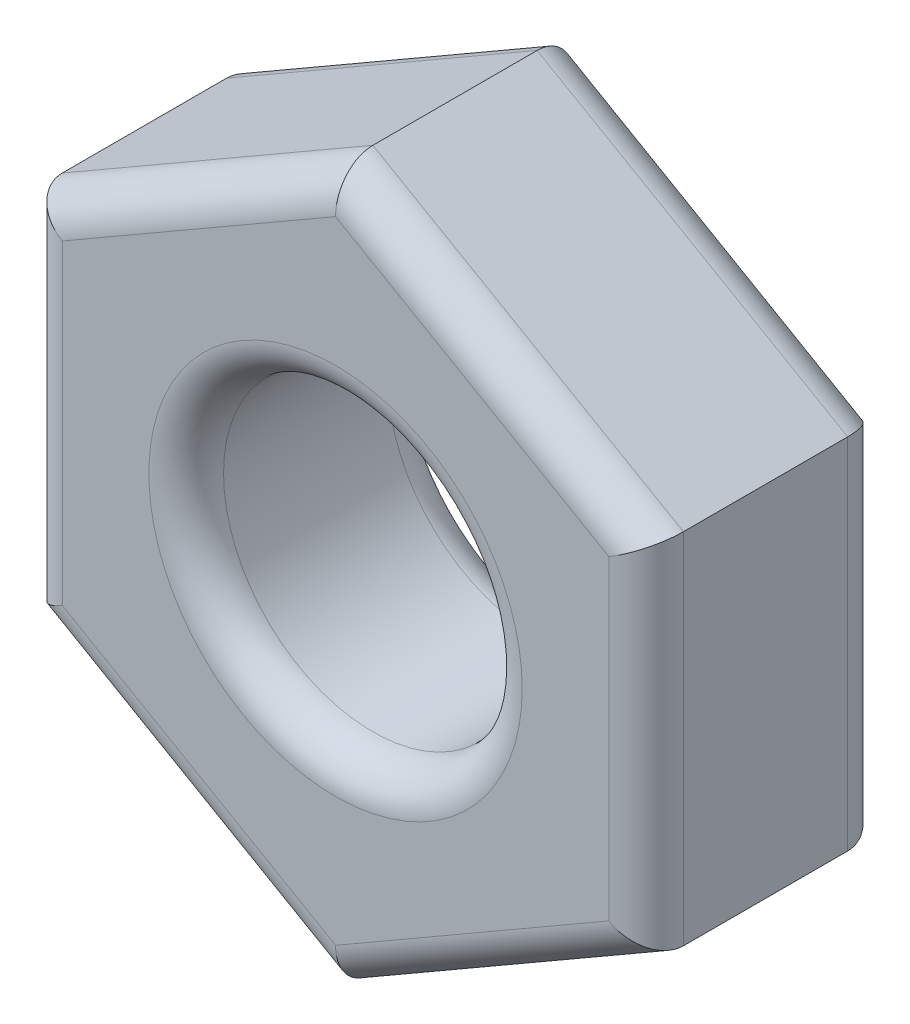
ISO-10303-21;
HEADER;
FILE_DESCRIPTION(('STEP AP214'),'2;1');
FILE_NAME('part.step','',(''),(''),'','','');
FILE_SCHEMA(('AUTOMOTIVE_DESIGN { 1 0 10303 214 1 1 1 1 }'));
ENDSEC;
DATA;
#1=APPLICATION_CONTEXT('core data for automotive mechanical design processes');
#2=APPLICATION_PROTOCOL_DEFINITION('international standard','automotive_design',2000,#1);
#3=PRODUCT_CONTEXT('',#1,'mechanical');
#4=PRODUCT('Part','Part','',(#3));
#5=PRODUCT_RELATED_PRODUCT_CATEGORY('part','',(#4));
#6=PRODUCT_DEFINITION_FORMATION('','',#4);
#7=PRODUCT_DEFINITION_CONTEXT('part definition',#1,'design');
#8=PRODUCT_DEFINITION('design','',#6,#7);
#9=PRODUCT_DEFINITION_SHAPE('','',#8);
#10=(LENGTH_UNIT() NAMED_UNIT(*) SI_UNIT(.MILLI.,.METRE.));
#11=(NAMED_UNIT(*) PLANE_ANGLE_UNIT() SI_UNIT($,.RADIAN.));
#12=(NAMED_UNIT(*) SI_UNIT($,.STERADIAN.) SOLID_ANGLE_UNIT());
#13=UNCERTAINTY_MEASURE_WITH_UNIT(LENGTH_MEASURE(1.E-05),#10,'distance_accuracy_value','');
#14=(GEOMETRIC_REPRESENTATION_CONTEXT(3) GLOBAL_UNCERTAINTY_ASSIGNED_CONTEXT((#13)) GLOBAL_UNIT_ASSIGNED_CONTEXT((#10,
#11,#12)) REPRESENTATION_CONTEXT('',''));
#15=CARTESIAN_POINT('',(0.,0.,0.));
#16=DIRECTION('',(0.,0.,1.));
#17=DIRECTION('',(1.,0.,0.));
#18=AXIS2_PLACEMENT_3D('',#15,#16,#17);
#19=CARTESIAN_POINT('',(0.,0.,0.8));
#20=DIRECTION('',(0.,0.,1.));
#21=DIRECTION('',(1.,0.,0.));
#22=AXIS2_PLACEMENT_3D('',#19,#20,#21);
#23=PLANE('',#22);
#24=CARTESIAN_POINT('',(0.,0.,0.8));
#25=DIRECTION('',(0.,0.,1.));
#26=DIRECTION('',(1.,0.,0.));
#27=AXIS2_PLACEMENT_3D('',#24,#25,#26);
#28=CIRCLE('',#27,1.25);
#29=CARTESIAN_POINT('',(1.25,0.,0.8));
#30=VERTEX_POINT('',#29);
#31=EDGE_CURVE('E153',#30,#30,#28,.F.);
#32=ORIENTED_EDGE('',*,*,#31,.T.);
#33=EDGE_LOOP('',(#32));
#34=FACE_BOUND('',#33,.T.);
#35=DIRECTION('',(0.,-1.,0.));
#36=VECTOR('',#35,1.);
#37=CARTESIAN_POINT('',(-1.83,-1.20088855991442,0.8));
#38=LINE('',#37,#36);
#39=CARTESIAN_POINT('',(-1.83,1.05655099261702,0.8));
#40=VERTEX_POINT('',#39);
#41=CARTESIAN_POINT('',(-1.83,-1.05655099261701,0.8));
#42=VERTEX_POINT('',#41);
#43=EDGE_CURVE('E151',#40,#42,#38,.T.);
#44=ORIENTED_EDGE('',*,*,#43,.T.);
#45=DIRECTION('',(0.866025403784439,-0.5,0.));
#46=VECTOR('',#45,1.);
#47=CARTESIAN_POINT('',(0.125,-2.18527076888273,0.8));
#48=LINE('',#47,#46);
#49=CARTESIAN_POINT('',(0.,-2.11310198523403,0.8));
#50=VERTEX_POINT('',#49);
#51=EDGE_CURVE('E133',#42,#50,#48,.T.);
#52=ORIENTED_EDGE('',*,*,#51,.T.);
#53=DIRECTION('',(0.866025403784439,0.5,0.));
#54=VECTOR('',#53,1.);
#55=CARTESIAN_POINT('',(1.955,-0.984382208968312,0.8));
#56=LINE('',#55,#54);
#57=CARTESIAN_POINT('',(1.83,-1.05655099261702,0.8));
#58=VERTEX_POINT('',#57);
#59=EDGE_CURVE('E141',#50,#58,#56,.T.);
#60=ORIENTED_EDGE('',*,*,#59,.T.);
#61=DIRECTION('',(0.,1.,0.));
#62=VECTOR('',#61,1.);
#63=CARTESIAN_POINT('',(1.83,1.20088855991442,0.8));
#64=LINE('',#63,#62);
#65=CARTESIAN_POINT('',(1.83,1.05655099261702,0.8));
#66=VERTEX_POINT('',#65);
#67=EDGE_CURVE('E147',#58,#66,#64,.T.);
#68=ORIENTED_EDGE('',*,*,#67,.T.);
#69=DIRECTION('',(-0.866025403784439,0.5,0.));
#70=VECTOR('',#69,1.);
#71=CARTESIAN_POINT('',(-0.125,2.18527076888273,0.8));
#72=LINE('',#71,#70);
#73=CARTESIAN_POINT('',(0.,2.11310198523403,0.8));
#74=VERTEX_POINT('',#73);
#75=EDGE_CURVE('E261',#66,#74,#72,.T.);
#76=ORIENTED_EDGE('',*,*,#75,.T.);
#77=DIRECTION('',(-0.866025403784439,-0.5,0.));
#78=VECTOR('',#77,1.);
#79=CARTESIAN_POINT('',(-1.955,0.984382208968313,0.8));
#80=LINE('',#79,#78);
#81=EDGE_CURVE('E158',#74,#40,#80,.T.);
#82=ORIENTED_EDGE('',*,*,#81,.T.);
#83=EDGE_LOOP('',(#44,#52,#60,#68,#76,#82));
#84=FACE_BOUND('',#83,.T.);
#85=ADVANCED_FACE('F37',(#34,#84),#23,.T.);
#86=CARTESIAN_POINT('',(0.,0.,-0.8));
#87=DIRECTION('',(0.,0.,1.));
#88=DIRECTION('',(1.,0.,0.));
#89=AXIS2_PLACEMENT_3D('',#86,#87,#88);
#90=PLANE('',#89);
#91=CARTESIAN_POINT('',(0.,0.,-0.8));
#92=DIRECTION('',(0.,0.,1.));
#93=DIRECTION('',(1.,0.,0.));
#94=AXIS2_PLACEMENT_3D('',#91,#92,#93);
#95=CIRCLE('',#94,1.25);
#96=CARTESIAN_POINT('',(1.25,0.,-0.8));
#97=VERTEX_POINT('',#96);
#98=EDGE_CURVE('E11',#97,#97,#95,.T.);
#99=ORIENTED_EDGE('',*,*,#98,.T.);
#100=EDGE_LOOP('',(#99));
#101=FACE_BOUND('',#100,.T.);
#102=DIRECTION('',(-0.866025403784439,0.5,0.));
#103=VECTOR('',#102,1.);
#104=CARTESIAN_POINT('',(0.915,1.58482648892552,-0.8));
#105=LINE('',#104,#103);
#106=CARTESIAN_POINT('',(0.,2.11310198523403,-0.8));
#107=VERTEX_POINT('',#106);
#108=CARTESIAN_POINT('',(1.83,1.05655099261702,-0.8));
#109=VERTEX_POINT('',#108);
#110=EDGE_CURVE('E54',#107,#109,#105,.F.);
#111=ORIENTED_EDGE('',*,*,#110,.T.);
#112=DIRECTION('',(0.,1.,0.));
#113=VECTOR('',#112,1.);
#114=CARTESIAN_POINT('',(1.83,0.,-0.8));
#115=LINE('',#114,#113);
#116=CARTESIAN_POINT('',(1.83,-1.05655099261702,-0.8));
#117=VERTEX_POINT('',#116);
#118=EDGE_CURVE('E46',#109,#117,#115,.F.);
#119=ORIENTED_EDGE('',*,*,#118,.T.);
#120=DIRECTION('',(0.866025403784439,0.5,0.));
#121=VECTOR('',#120,1.);
#122=CARTESIAN_POINT('',(0.914999999999999,-1.58482648892552,-0.8));
#123=LINE('',#122,#121);
#124=CARTESIAN_POINT('',(0.,-2.11310198523403,-0.8));
#125=VERTEX_POINT('',#124);
#126=EDGE_CURVE('E185',#117,#125,#123,.F.);
#127=ORIENTED_EDGE('',*,*,#126,.T.);
#128=DIRECTION('',(0.866025403784439,-0.5,0.));
#129=VECTOR('',#128,1.);
#130=CARTESIAN_POINT('',(-0.915,-1.58482648892552,-0.8));
#131=LINE('',#130,#129);
#132=CARTESIAN_POINT('',(-1.83,-1.05655099261701,-0.8));
#133=VERTEX_POINT('',#132);
#134=EDGE_CURVE('E187',#125,#133,#131,.F.);
#135=ORIENTED_EDGE('',*,*,#134,.T.);
#136=DIRECTION('',(0.,-1.,0.));
#137=VECTOR('',#136,1.);
#138=CARTESIAN_POINT('',(-1.83,0.,-0.8));
#139=LINE('',#138,#137);
#140=CARTESIAN_POINT('',(-1.83,1.05655099261702,-0.8));
#141=VERTEX_POINT('',#140);
#142=EDGE_CURVE('E189',#133,#141,#139,.F.);
#143=ORIENTED_EDGE('',*,*,#142,.T.);
#144=DIRECTION('',(-0.866025403784439,-0.5,0.));
#145=VECTOR('',#144,1.);
#146=CARTESIAN_POINT('',(-0.915,1.58482648892552,-0.8));
#147=LINE('',#146,#145);
#148=EDGE_CURVE('E59',#141,#107,#147,.F.);
#149=ORIENTED_EDGE('',*,*,#148,.T.);
#150=EDGE_LOOP('',(#111,#119,#127,#135,#143,#149));
#151=FACE_BOUND('',#150,.T.);
#152=ADVANCED_FACE('F230',(#101,#151),#90,.F.);
#153=CARTESIAN_POINT('',(0.,-2.40177711982884,0.8));
#154=DIRECTION('',(-0.5,0.866025403784439,0.));
#155=DIRECTION('',(-0.866025403784439,-0.5,0.));
#156=AXIS2_PLACEMENT_3D('',#153,#154,#155);
#157=PLANE('',#156);
#158=DIRECTION('',(0.,0.,-1.));
#159=VECTOR('',#158,1.);
#160=CARTESIAN_POINT('',(2.08,-1.20088855991442,0.8));
#161=LINE('',#160,#159);
#162=CARTESIAN_POINT('',(2.08,-1.20088855991442,0.55));
#163=VERTEX_POINT('',#162);
#164=CARTESIAN_POINT('',(2.08,-1.20088855991442,-0.55));
#165=VERTEX_POINT('',#164);
#166=EDGE_CURVE('E242',#163,#165,#161,.T.);
#167=ORIENTED_EDGE('',*,*,#166,.F.);
#168=DIRECTION('',(0.866025403784439,0.5,0.));
#169=VECTOR('',#168,1.);
#170=CARTESIAN_POINT('',(0.,-2.40177711982884,0.55));
#171=LINE('',#170,#169);
#172=CARTESIAN_POINT('',(0.,-2.40177711982884,0.55));
#173=VERTEX_POINT('',#172);
#174=EDGE_CURVE('E183',#163,#173,#171,.F.);
#175=ORIENTED_EDGE('',*,*,#174,.T.);
#176=DIRECTION('',(0.,0.,-1.));
#177=VECTOR('',#176,1.);
#178=CARTESIAN_POINT('',(0.,-2.40177711982884,0.8));
#179=LINE('',#178,#177);
#180=CARTESIAN_POINT('',(0.,-2.40177711982884,-0.55));
#181=VERTEX_POINT('',#180);
#182=EDGE_CURVE('E205',#173,#181,#179,.T.);
#183=ORIENTED_EDGE('',*,*,#182,.T.);
#184=DIRECTION('',(0.866025403784439,0.5,0.));
#185=VECTOR('',#184,1.);
#186=CARTESIAN_POINT('',(0.,-2.40177711982884,-0.55));
#187=LINE('',#186,#185);
#188=EDGE_CURVE('E181',#181,#165,#187,.T.);
#189=ORIENTED_EDGE('',*,*,#188,.T.);
#190=EDGE_LOOP('',(#167,#175,#183,#189));
#191=FACE_BOUND('',#190,.T.);
#192=ADVANCED_FACE('F241',(#191),#157,.F.);
#193=CARTESIAN_POINT('',(2.08,-1.20088855991442,0.8));
#194=DIRECTION('',(-1.,0.,0.));
#195=DIRECTION('',(0.,-1.,0.));
#196=AXIS2_PLACEMENT_3D('',#193,#194,#195);
#197=PLANE('',#196);
#198=DIRECTION('',(0.,0.,-1.));
#199=VECTOR('',#198,1.);
#200=CARTESIAN_POINT('',(2.08,1.20088855991442,0.8));
#201=LINE('',#200,#199);
#202=CARTESIAN_POINT('',(2.08,1.20088855991442,0.55));
#203=VERTEX_POINT('',#202);
#204=CARTESIAN_POINT('',(2.08,1.20088855991442,-0.55));
#205=VERTEX_POINT('',#204);
#206=EDGE_CURVE('E250',#203,#205,#201,.T.);
#207=ORIENTED_EDGE('',*,*,#206,.F.);
#208=DIRECTION('',(0.,1.,0.));
#209=VECTOR('',#208,1.);
#210=CARTESIAN_POINT('',(2.08,-1.20088855991442,0.55));
#211=LINE('',#210,#209);
#212=EDGE_CURVE('E179',#203,#163,#211,.F.);
#213=ORIENTED_EDGE('',*,*,#212,.T.);
#214=ORIENTED_EDGE('',*,*,#166,.T.);
#215=DIRECTION('',(0.,1.,0.));
#216=VECTOR('',#215,1.);
#217=CARTESIAN_POINT('',(2.08,-1.20088855991442,-0.55));
#218=LINE('',#217,#216);
#219=EDGE_CURVE('E176',#165,#205,#218,.T.);
#220=ORIENTED_EDGE('',*,*,#219,.T.);
#221=EDGE_LOOP('',(#207,#213,#214,#220));
#222=FACE_BOUND('',#221,.T.);
#223=ADVANCED_FACE('F246',(#222),#197,.F.);
#224=CARTESIAN_POINT('',(2.08,1.20088855991442,0.8));
#225=DIRECTION('',(-0.5,-0.866025403784439,0.));
#226=DIRECTION('',(0.866025403784439,-0.5,0.));
#227=AXIS2_PLACEMENT_3D('',#224,#225,#226);
#228=PLANE('',#227);
#229=DIRECTION('',(0.,0.,-1.));
#230=VECTOR('',#229,1.);
#231=CARTESIAN_POINT('',(0.,2.40177711982884,0.8));
#232=LINE('',#231,#230);
#233=CARTESIAN_POINT('',(0.,2.40177711982884,0.55));
#234=VERTEX_POINT('',#233);
#235=CARTESIAN_POINT('',(0.,2.40177711982884,-0.55));
#236=VERTEX_POINT('',#235);
#237=EDGE_CURVE('E254',#234,#236,#232,.T.);
#238=ORIENTED_EDGE('',*,*,#237,.F.);
#239=DIRECTION('',(-0.866025403784439,0.5,0.));
#240=VECTOR('',#239,1.);
#241=CARTESIAN_POINT('',(2.08,1.20088855991442,0.55));
#242=LINE('',#241,#240);
#243=EDGE_CURVE('E174',#234,#203,#242,.F.);
#244=ORIENTED_EDGE('',*,*,#243,.T.);
#245=ORIENTED_EDGE('',*,*,#206,.T.);
#246=DIRECTION('',(-0.866025403784439,0.5,0.));
#247=VECTOR('',#246,1.);
#248=CARTESIAN_POINT('',(2.08,1.20088855991442,-0.55));
#249=LINE('',#248,#247);
#250=EDGE_CURVE('E172',#205,#236,#249,.T.);
#251=ORIENTED_EDGE('',*,*,#250,.T.);
#252=EDGE_LOOP('',(#238,#244,#245,#251));
#253=FACE_BOUND('',#252,.T.);
#254=ADVANCED_FACE('F322',(#253),#228,.F.);
#255=CARTESIAN_POINT('',(0.,2.40177711982884,0.8));
#256=DIRECTION('',(0.5,-0.866025403784439,0.));
#257=DIRECTION('',(0.866025403784439,0.5,0.));
#258=AXIS2_PLACEMENT_3D('',#255,#256,#257);
#259=PLANE('',#258);
#260=DIRECTION('',(0.,0.,-1.));
#261=VECTOR('',#260,1.);
#262=CARTESIAN_POINT('',(-2.08,1.20088855991442,0.8));
#263=LINE('',#262,#261);
#264=CARTESIAN_POINT('',(-2.08,1.20088855991442,0.55));
#265=VERTEX_POINT('',#264);
#266=CARTESIAN_POINT('',(-2.08,1.20088855991442,-0.55));
#267=VERTEX_POINT('',#266);
#268=EDGE_CURVE('E281',#265,#267,#263,.T.);
#269=ORIENTED_EDGE('',*,*,#268,.F.);
#270=DIRECTION('',(-0.866025403784439,-0.5,0.));
#271=VECTOR('',#270,1.);
#272=CARTESIAN_POINT('',(0.,2.40177711982884,0.55));
#273=LINE('',#272,#271);
#274=EDGE_CURVE('E170',#265,#234,#273,.F.);
#275=ORIENTED_EDGE('',*,*,#274,.T.);
#276=ORIENTED_EDGE('',*,*,#237,.T.);
#277=DIRECTION('',(-0.866025403784439,-0.5,0.));
#278=VECTOR('',#277,1.);
#279=CARTESIAN_POINT('',(0.,2.40177711982884,-0.55));
#280=LINE('',#279,#278);
#281=EDGE_CURVE('E168',#236,#267,#280,.T.);
#282=ORIENTED_EDGE('',*,*,#281,.T.);
#283=EDGE_LOOP('',(#269,#275,#276,#282));
#284=FACE_BOUND('',#283,.T.);
#285=ADVANCED_FACE('F288',(#284),#259,.F.);
#286=CARTESIAN_POINT('',(-2.08,1.20088855991442,0.8));
#287=DIRECTION('',(1.,0.,0.));
#288=DIRECTION('',(0.,0.,-1.));
#289=AXIS2_PLACEMENT_3D('',#286,#287,#288);
#290=PLANE('',#289);
#291=DIRECTION('',(0.,0.,-1.));
#292=VECTOR('',#291,1.);
#293=CARTESIAN_POINT('',(-2.08,-1.20088855991442,0.8));
#294=LINE('',#293,#292);
#295=CARTESIAN_POINT('',(-2.08,-1.20088855991442,0.55));
#296=VERTEX_POINT('',#295);
#297=CARTESIAN_POINT('',(-2.08,-1.20088855991442,-0.55));
#298=VERTEX_POINT('',#297);
#299=EDGE_CURVE('E279',#296,#298,#294,.T.);
#300=ORIENTED_EDGE('',*,*,#299,.F.);
#301=DIRECTION('',(0.,-1.,0.));
#302=VECTOR('',#301,1.);
#303=CARTESIAN_POINT('',(-2.08,1.20088855991442,0.55));
#304=LINE('',#303,#302);
#305=EDGE_CURVE('E166',#296,#265,#304,.F.);
#306=ORIENTED_EDGE('',*,*,#305,.T.);
#307=ORIENTED_EDGE('',*,*,#268,.T.);
#308=DIRECTION('',(0.,-1.,0.));
#309=VECTOR('',#308,1.);
#310=CARTESIAN_POINT('',(-2.08,1.20088855991442,-0.55));
#311=LINE('',#310,#309);
#312=EDGE_CURVE('E164',#267,#298,#311,.T.);
#313=ORIENTED_EDGE('',*,*,#312,.T.);
#314=EDGE_LOOP('',(#300,#306,#307,#313));
#315=FACE_BOUND('',#314,.T.);
#316=ADVANCED_FACE('F280',(#315),#290,.F.);
#317=CARTESIAN_POINT('',(-2.08,-1.20088855991442,0.8));
#318=DIRECTION('',(0.5,0.866025403784439,0.));
#319=DIRECTION('',(-0.866025403784439,0.5,0.));
#320=AXIS2_PLACEMENT_3D('',#317,#318,#319);
#321=PLANE('',#320);
#322=ORIENTED_EDGE('',*,*,#182,.F.);
#323=DIRECTION('',(0.866025403784439,-0.5,0.));
#324=VECTOR('',#323,1.);
#325=CARTESIAN_POINT('',(-2.08,-1.20088855991442,0.55));
#326=LINE('',#325,#324);
#327=EDGE_CURVE('E135',#173,#296,#326,.F.);
#328=ORIENTED_EDGE('',*,*,#327,.T.);
#329=ORIENTED_EDGE('',*,*,#299,.T.);
#330=DIRECTION('',(0.866025403784439,-0.5,0.));
#331=VECTOR('',#330,1.);
#332=CARTESIAN_POINT('',(-2.08,-1.20088855991442,-0.55));
#333=LINE('',#332,#331);
#334=EDGE_CURVE('E156',#298,#181,#333,.T.);
#335=ORIENTED_EDGE('',*,*,#334,.T.);
#336=EDGE_LOOP('',(#322,#328,#329,#335));
#337=FACE_BOUND('',#336,.T.);
#338=ADVANCED_FACE('F278',(#337),#321,.F.);
#339=CARTESIAN_POINT('',(0.,0.,0.8));
#340=DIRECTION('',(0.,0.,-1.));
#341=DIRECTION('',(-1.,0.,0.));
#342=AXIS2_PLACEMENT_3D('',#339,#340,#341);
#343=CYLINDRICAL_SURFACE('',#342,1.);
#344=CARTESIAN_POINT('',(0.,0.,0.55));
#345=DIRECTION('',(0.,0.,1.));
#346=DIRECTION('',(1.,0.,0.));
#347=AXIS2_PLACEMENT_3D('',#344,#345,#346);
#348=CIRCLE('',#347,1.);
#349=CARTESIAN_POINT('',(1.,0.,0.55));
#350=VERTEX_POINT('',#349);
#351=EDGE_CURVE('E148',#350,#350,#348,.T.);
#352=ORIENTED_EDGE('',*,*,#351,.T.);
#353=EDGE_LOOP('',(#352));
#354=FACE_BOUND('',#353,.T.);
#355=CARTESIAN_POINT('',(0.,0.,-0.55));
#356=DIRECTION('',(0.,0.,1.));
#357=DIRECTION('',(1.,0.,0.));
#358=AXIS2_PLACEMENT_3D('',#355,#356,#357);
#359=CIRCLE('',#358,1.);
#360=CARTESIAN_POINT('',(1.,0.,-0.55));
#361=VERTEX_POINT('',#360);
#362=EDGE_CURVE('E249',#361,#361,#359,.F.);
#363=ORIENTED_EDGE('',*,*,#362,.T.);
#364=EDGE_LOOP('',(#363));
#365=FACE_BOUND('',#364,.T.);
#366=ADVANCED_FACE('F314',(#354,#365),#343,.F.);
#367=CARTESIAN_POINT('',(0.,0.,0.55));
#368=DIRECTION('',(0.,0.,1.));
#369=DIRECTION('',(1.,0.,0.));
#370=AXIS2_PLACEMENT_3D('',#367,#368,#369);
#371=TOROIDAL_SURFACE('',#370,1.25,0.25);
#372=ORIENTED_EDGE('',*,*,#31,.F.);
#373=EDGE_LOOP('',(#372));
#374=FACE_BOUND('',#373,.T.);
#375=ORIENTED_EDGE('',*,*,#351,.F.);
#376=EDGE_LOOP('',(#375));
#377=FACE_BOUND('',#376,.T.);
#378=ADVANCED_FACE('F329',(#374,#377),#371,.T.);
#379=CARTESIAN_POINT('',(0.915,1.58482648892552,0.55));
#380=DIRECTION('',(0.866025403784439,-0.5,0.));
#381=DIRECTION('',(0.5,0.866025403784439,0.));
#382=AXIS2_PLACEMENT_3D('',#379,#380,#381);
#383=CYLINDRICAL_SURFACE('',#382,0.25);
#384=CARTESIAN_POINT('',(1.83,1.05655099261702,0.55));
#385=DIRECTION('',(0.5,-0.866025403784439,0.));
#386=DIRECTION('',(-0.866025403784439,-0.5,0.));
#387=AXIS2_PLACEMENT_3D('',#384,#385,#386);
#388=ELLIPSE('',#387,0.288675134594813,0.25);
#389=EDGE_CURVE('E199',#203,#66,#388,.T.);
#390=ORIENTED_EDGE('',*,*,#389,.F.);
#391=ORIENTED_EDGE('',*,*,#243,.F.);
#392=CARTESIAN_POINT('',(0.,2.11310198523403,0.55));
#393=DIRECTION('',(1.,0.,0.));
#394=DIRECTION('',(0.,-1.,0.));
#395=AXIS2_PLACEMENT_3D('',#392,#393,#394);
#396=ELLIPSE('',#395,0.288675134594813,0.25);
#397=EDGE_CURVE('E202',#74,#234,#396,.F.);
#398=ORIENTED_EDGE('',*,*,#397,.F.);
#399=ORIENTED_EDGE('',*,*,#75,.F.);
#400=EDGE_LOOP('',(#390,#391,#398,#399));
#401=FACE_BOUND('',#400,.T.);
#402=ADVANCED_FACE('F332',(#401),#383,.T.);
#403=CARTESIAN_POINT('',(-0.915,1.58482648892552,0.55));
#404=DIRECTION('',(0.866025403784439,0.5,0.));
#405=DIRECTION('',(-0.5,0.866025403784439,0.));
#406=AXIS2_PLACEMENT_3D('',#403,#404,#405);
#407=CYLINDRICAL_SURFACE('',#406,0.25);
#408=ORIENTED_EDGE('',*,*,#397,.T.);
#409=ORIENTED_EDGE('',*,*,#274,.F.);
#410=CARTESIAN_POINT('',(-1.83,1.05655099261702,0.55));
#411=DIRECTION('',(0.5,0.866025403784439,0.));
#412=DIRECTION('',(0.866025403784439,-0.5,0.));
#413=AXIS2_PLACEMENT_3D('',#410,#411,#412);
#414=ELLIPSE('',#413,0.288675134594813,0.25);
#415=EDGE_CURVE('E196',#40,#265,#414,.F.);
#416=ORIENTED_EDGE('',*,*,#415,.F.);
#417=ORIENTED_EDGE('',*,*,#81,.F.);
#418=EDGE_LOOP('',(#408,#409,#416,#417));
#419=FACE_BOUND('',#418,.T.);
#420=ADVANCED_FACE('F268',(#419),#407,.T.);
#421=CARTESIAN_POINT('',(1.83,0.,0.55));
#422=DIRECTION('',(0.,-1.,0.));
#423=DIRECTION('',(1.,0.,0.));
#424=AXIS2_PLACEMENT_3D('',#421,#422,#423);
#425=CYLINDRICAL_SURFACE('',#424,0.25);
#426=ORIENTED_EDGE('',*,*,#389,.T.);
#427=ORIENTED_EDGE('',*,*,#67,.F.);
#428=CARTESIAN_POINT('',(1.83,-1.05655099261702,0.55));
#429=DIRECTION('',(-0.5,-0.866025403784438,0.));
#430=DIRECTION('',(-0.866025403784438,0.5,0.));
#431=AXIS2_PLACEMENT_3D('',#428,#429,#430);
#432=ELLIPSE('',#431,0.288675134594813,0.25);
#433=EDGE_CURVE('E144',#163,#58,#432,.T.);
#434=ORIENTED_EDGE('',*,*,#433,.F.);
#435=ORIENTED_EDGE('',*,*,#212,.F.);
#436=EDGE_LOOP('',(#426,#427,#434,#435));
#437=FACE_BOUND('',#436,.T.);
#438=ADVANCED_FACE('F341',(#437),#425,.T.);
#439=CARTESIAN_POINT('',(-1.83,0.,0.55));
#440=DIRECTION('',(0.,1.,0.));
#441=DIRECTION('',(0.,0.,1.));
#442=AXIS2_PLACEMENT_3D('',#439,#440,#441);
#443=CYLINDRICAL_SURFACE('',#442,0.25);
#444=ORIENTED_EDGE('',*,*,#415,.T.);
#445=ORIENTED_EDGE('',*,*,#305,.F.);
#446=CARTESIAN_POINT('',(-1.83,-1.05655099261701,0.55));
#447=DIRECTION('',(-0.5,0.866025403784439,0.));
#448=DIRECTION('',(0.866025403784439,0.5,0.));
#449=AXIS2_PLACEMENT_3D('',#446,#447,#448);
#450=ELLIPSE('',#449,0.288675134594813,0.25);
#451=EDGE_CURVE('E138',#42,#296,#450,.F.);
#452=ORIENTED_EDGE('',*,*,#451,.F.);
#453=ORIENTED_EDGE('',*,*,#43,.F.);
#454=EDGE_LOOP('',(#444,#445,#452,#453));
#455=FACE_BOUND('',#454,.T.);
#456=ADVANCED_FACE('F271',(#455),#443,.T.);
#457=CARTESIAN_POINT('',(0.914999999999999,-1.58482648892552,0.55));
#458=DIRECTION('',(-0.866025403784439,-0.5,0.));
#459=DIRECTION('',(0.5,-0.866025403784439,0.));
#460=AXIS2_PLACEMENT_3D('',#457,#458,#459);
#461=CYLINDRICAL_SURFACE('',#460,0.25);
#462=ORIENTED_EDGE('',*,*,#433,.T.);
#463=ORIENTED_EDGE('',*,*,#59,.F.);
#464=CARTESIAN_POINT('',(0.,-2.11310198523403,0.55));
#465=DIRECTION('',(-1.,0.,0.));
#466=DIRECTION('',(0.,-1.,0.));
#467=AXIS2_PLACEMENT_3D('',#464,#465,#466);
#468=ELLIPSE('',#467,0.288675134594813,0.25);
#469=EDGE_CURVE('E129',#173,#50,#468,.T.);
#470=ORIENTED_EDGE('',*,*,#469,.F.);
#471=ORIENTED_EDGE('',*,*,#174,.F.);
#472=EDGE_LOOP('',(#462,#463,#470,#471));
#473=FACE_BOUND('',#472,.T.);
#474=ADVANCED_FACE('F142',(#473),#461,.T.);
#475=CARTESIAN_POINT('',(-0.915,-1.58482648892552,0.55));
#476=DIRECTION('',(-0.866025403784439,0.5,0.));
#477=DIRECTION('',(-0.5,-0.866025403784439,0.));
#478=AXIS2_PLACEMENT_3D('',#475,#476,#477);
#479=CYLINDRICAL_SURFACE('',#478,0.25);
#480=ORIENTED_EDGE('',*,*,#451,.T.);
#481=ORIENTED_EDGE('',*,*,#327,.F.);
#482=ORIENTED_EDGE('',*,*,#469,.T.);
#483=ORIENTED_EDGE('',*,*,#51,.F.);
#484=EDGE_LOOP('',(#480,#481,#482,#483));
#485=FACE_BOUND('',#484,.T.);
#486=ADVANCED_FACE('F131',(#485),#479,.T.);
#487=CARTESIAN_POINT('',(0.,0.,-0.55));
#488=DIRECTION('',(0.,0.,1.));
#489=DIRECTION('',(1.,0.,0.));
#490=AXIS2_PLACEMENT_3D('',#487,#488,#489);
#491=TOROIDAL_SURFACE('',#490,1.25,0.25);
#492=ORIENTED_EDGE('',*,*,#362,.F.);
#493=EDGE_LOOP('',(#492));
#494=FACE_BOUND('',#493,.T.);
#495=ORIENTED_EDGE('',*,*,#98,.F.);
#496=EDGE_LOOP('',(#495));
#497=FACE_BOUND('',#496,.T.);
#498=ADVANCED_FACE('F336',(#494,#497),#491,.T.);
#499=CARTESIAN_POINT('',(-1.83,1.20088855991442,-0.55));
#500=DIRECTION('',(0.,-1.,0.));
#501=DIRECTION('',(0.,0.,-1.));
#502=AXIS2_PLACEMENT_3D('',#499,#500,#501);
#503=CYLINDRICAL_SURFACE('',#502,0.25);
#504=CARTESIAN_POINT('',(-1.83,1.05655099261702,-0.55));
#505=DIRECTION('',(-0.5,-0.866025403784439,0.));
#506=DIRECTION('',(0.866025403784439,-0.5,0.));
#507=AXIS2_PLACEMENT_3D('',#504,#505,#506);
#508=ELLIPSE('',#507,0.288675134594813,0.25);
#509=EDGE_CURVE('E215',#141,#267,#508,.F.);
#510=ORIENTED_EDGE('',*,*,#509,.F.);
#511=ORIENTED_EDGE('',*,*,#142,.F.);
#512=CARTESIAN_POINT('',(-1.83,-1.05655099261701,-0.55));
#513=DIRECTION('',(0.5,-0.866025403784439,0.));
#514=DIRECTION('',(0.866025403784439,0.5,0.));
#515=AXIS2_PLACEMENT_3D('',#512,#513,#514);
#516=ELLIPSE('',#515,0.288675134594813,0.25);
#517=EDGE_CURVE('E41',#298,#133,#516,.T.);
#518=ORIENTED_EDGE('',*,*,#517,.F.);
#519=ORIENTED_EDGE('',*,*,#312,.F.);
#520=EDGE_LOOP('',(#510,#511,#518,#519));
#521=FACE_BOUND('',#520,.T.);
#522=ADVANCED_FACE('F39',(#521),#503,.T.);
#523=CARTESIAN_POINT('',(-1.955,-0.984382208968311,-0.55));
#524=DIRECTION('',(0.866025403784439,-0.5,0.));
#525=DIRECTION('',(0.5,0.866025403784439,0.));
#526=AXIS2_PLACEMENT_3D('',#523,#524,#525);
#527=CYLINDRICAL_SURFACE('',#526,0.25);
#528=ORIENTED_EDGE('',*,*,#517,.T.);
#529=ORIENTED_EDGE('',*,*,#134,.F.);
#530=CARTESIAN_POINT('',(0.,-2.11310198523403,-0.55));
#531=DIRECTION('',(1.,0.,0.));
#532=DIRECTION('',(0.,1.,0.));
#533=AXIS2_PLACEMENT_3D('',#530,#531,#532);
#534=ELLIPSE('',#533,0.288675134594813,0.25);
#535=EDGE_CURVE('E213',#181,#125,#534,.T.);
#536=ORIENTED_EDGE('',*,*,#535,.F.);
#537=ORIENTED_EDGE('',*,*,#334,.F.);
#538=EDGE_LOOP('',(#528,#529,#536,#537));
#539=FACE_BOUND('',#538,.T.);
#540=ADVANCED_FACE('F225',(#539),#527,.T.);
#541=CARTESIAN_POINT('',(0.125,2.18527076888273,-0.55));
#542=DIRECTION('',(-0.866025403784439,-0.5,0.));
#543=DIRECTION('',(0.5,-0.866025403784439,0.));
#544=AXIS2_PLACEMENT_3D('',#541,#542,#543);
#545=CYLINDRICAL_SURFACE('',#544,0.25);
#546=ORIENTED_EDGE('',*,*,#509,.T.);
#547=ORIENTED_EDGE('',*,*,#281,.F.);
#548=CARTESIAN_POINT('',(0.,2.11310198523403,-0.55));
#549=DIRECTION('',(-1.,0.,0.));
#550=DIRECTION('',(0.,-1.,0.));
#551=AXIS2_PLACEMENT_3D('',#548,#549,#550);
#552=ELLIPSE('',#551,0.288675134594813,0.25);
#553=EDGE_CURVE('E210',#107,#236,#552,.F.);
#554=ORIENTED_EDGE('',*,*,#553,.F.);
#555=ORIENTED_EDGE('',*,*,#148,.F.);
#556=EDGE_LOOP('',(#546,#547,#554,#555));
#557=FACE_BOUND('',#556,.T.);
#558=ADVANCED_FACE('F291',(#557),#545,.T.);
#559=CARTESIAN_POINT('',(-0.125,-2.18527076888273,-0.55));
#560=DIRECTION('',(0.866025403784439,0.5,0.));
#561=DIRECTION('',(-0.5,0.866025403784439,0.));
#562=AXIS2_PLACEMENT_3D('',#559,#560,#561);
#563=CYLINDRICAL_SURFACE('',#562,0.25);
#564=ORIENTED_EDGE('',*,*,#535,.T.);
#565=ORIENTED_EDGE('',*,*,#126,.F.);
#566=CARTESIAN_POINT('',(1.83,-1.05655099261702,-0.55));
#567=DIRECTION('',(0.5,0.866025403784438,0.));
#568=DIRECTION('',(0.866025403784438,-0.5,0.));
#569=AXIS2_PLACEMENT_3D('',#566,#567,#568);
#570=ELLIPSE('',#569,0.288675134594813,0.25);
#571=EDGE_CURVE('E208',#165,#117,#570,.T.);
#572=ORIENTED_EDGE('',*,*,#571,.F.);
#573=ORIENTED_EDGE('',*,*,#188,.F.);
#574=EDGE_LOOP('',(#564,#565,#572,#573));
#575=FACE_BOUND('',#574,.T.);
#576=ADVANCED_FACE('F234',(#575),#563,.T.);
#577=CARTESIAN_POINT('',(1.955,0.984382208968313,-0.55));
#578=DIRECTION('',(-0.866025403784439,0.5,0.));
#579=DIRECTION('',(-0.5,-0.866025403784439,0.));
#580=AXIS2_PLACEMENT_3D('',#577,#578,#579);
#581=CYLINDRICAL_SURFACE('',#580,0.25);
#582=ORIENTED_EDGE('',*,*,#553,.T.);
#583=ORIENTED_EDGE('',*,*,#250,.F.);
#584=CARTESIAN_POINT('',(1.83,1.05655099261702,-0.55));
#585=DIRECTION('',(-0.5,0.866025403784439,0.));
#586=DIRECTION('',(-0.866025403784439,-0.5,0.));
#587=AXIS2_PLACEMENT_3D('',#584,#585,#586);
#588=ELLIPSE('',#587,0.288675134594813,0.25);
#589=EDGE_CURVE('E206',#109,#205,#588,.F.);
#590=ORIENTED_EDGE('',*,*,#589,.F.);
#591=ORIENTED_EDGE('',*,*,#110,.F.);
#592=EDGE_LOOP('',(#582,#583,#590,#591));
#593=FACE_BOUND('',#592,.T.);
#594=ADVANCED_FACE('F294',(#593),#581,.T.);
#595=CARTESIAN_POINT('',(1.83,-1.20088855991442,-0.55));
#596=DIRECTION('',(0.,1.,0.));
#597=DIRECTION('',(-1.,0.,0.));
#598=AXIS2_PLACEMENT_3D('',#595,#596,#597);
#599=CYLINDRICAL_SURFACE('',#598,0.25);
#600=ORIENTED_EDGE('',*,*,#571,.T.);
#601=ORIENTED_EDGE('',*,*,#118,.F.);
#602=ORIENTED_EDGE('',*,*,#589,.T.);
#603=ORIENTED_EDGE('',*,*,#219,.F.);
#604=EDGE_LOOP('',(#600,#601,#602,#603));
#605=FACE_BOUND('',#604,.T.);
#606=ADVANCED_FACE('F297',(#605),#599,.T.);
#607=CLOSED_SHELL('',(#85,#152,#192,#223,#254,#285,#316,#338,#366,#378,#402,#420,#438,#456,#474,
#486,#498,#522,#540,#558,#576,#594,#606));
#608=MANIFOLD_SOLID_BREP('B2',#607);
#609=ADVANCED_BREP_SHAPE_REPRESENTATION('',(#18,#608),#14);
#610=SHAPE_DEFINITION_REPRESENTATION(#9,#609);
ENDSEC;
END-ISO-10303-21;
